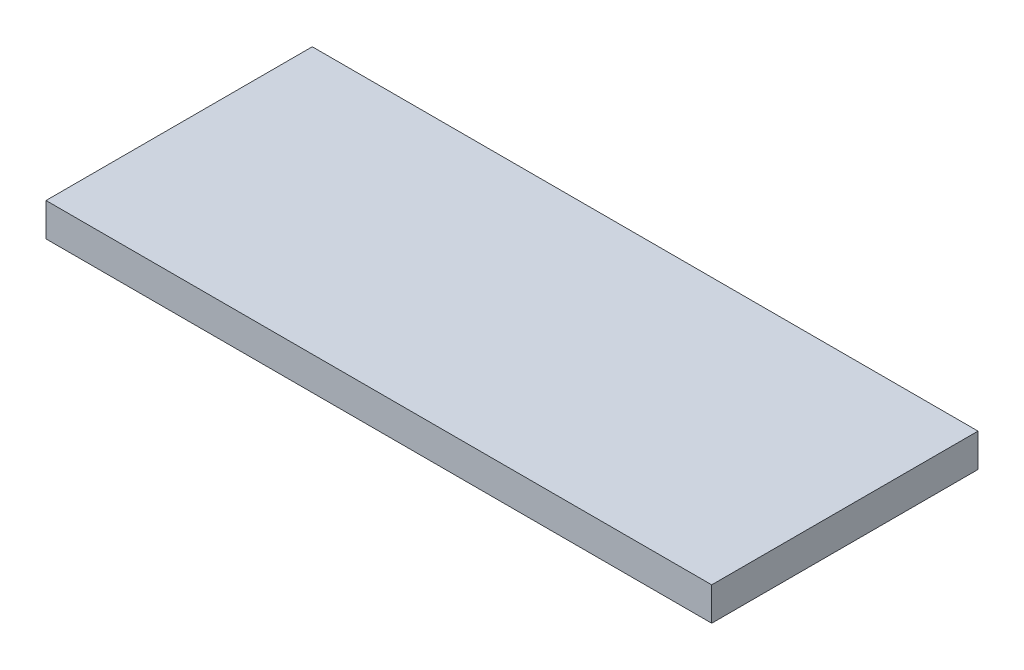
ISO-10303-21;
HEADER;
FILE_DESCRIPTION(('STEP AP214'),'2;1');
FILE_NAME('part.step','',(''),(''),'','','');
FILE_SCHEMA(('AUTOMOTIVE_DESIGN { 1 0 10303 214 1 1 1 1 }'));
ENDSEC;
DATA;
#1=APPLICATION_CONTEXT('core data for automotive mechanical design processes');
#2=APPLICATION_PROTOCOL_DEFINITION('international standard','automotive_design',2000,#1);
#3=PRODUCT_CONTEXT('',#1,'mechanical');
#4=PRODUCT('Part','Part','',(#3));
#5=PRODUCT_RELATED_PRODUCT_CATEGORY('part','',(#4));
#6=PRODUCT_DEFINITION_FORMATION('','',#4);
#7=PRODUCT_DEFINITION_CONTEXT('part definition',#1,'design');
#8=PRODUCT_DEFINITION('design','',#6,#7);
#9=PRODUCT_DEFINITION_SHAPE('','',#8);
#10=(LENGTH_UNIT() NAMED_UNIT(*) SI_UNIT(.MILLI.,.METRE.));
#11=(NAMED_UNIT(*) PLANE_ANGLE_UNIT() SI_UNIT($,.RADIAN.));
#12=(NAMED_UNIT(*) SI_UNIT($,.STERADIAN.) SOLID_ANGLE_UNIT());
#13=UNCERTAINTY_MEASURE_WITH_UNIT(LENGTH_MEASURE(1.E-05),#10,'distance_accuracy_value','');
#14=(GEOMETRIC_REPRESENTATION_CONTEXT(3) GLOBAL_UNCERTAINTY_ASSIGNED_CONTEXT((#13)) GLOBAL_UNIT_ASSIGNED_CONTEXT((#10,
#11,#12)) REPRESENTATION_CONTEXT('',''));
#15=CARTESIAN_POINT('',(0.,0.,0.));
#16=DIRECTION('',(0.,0.,1.));
#17=DIRECTION('',(1.,0.,0.));
#18=AXIS2_PLACEMENT_3D('',#15,#16,#17);
#19=CARTESIAN_POINT('',(0.,3.175,0.));
#20=DIRECTION('',(1.,0.,0.));
#21=DIRECTION('',(0.,0.,-1.));
#22=AXIS2_PLACEMENT_3D('',#19,#20,#21);
#23=PLANE('',#22);
#24=DIRECTION('',(0.,0.,1.));
#25=VECTOR('',#24,1.);
#26=CARTESIAN_POINT('',(0.,0.,0.));
#27=LINE('',#26,#25);
#28=CARTESIAN_POINT('',(0.,0.,0.));
#29=VERTEX_POINT('',#28);
#30=CARTESIAN_POINT('',(0.,0.,25.4));
#31=VERTEX_POINT('',#30);
#32=EDGE_CURVE('E96',#29,#31,#27,.T.);
#33=ORIENTED_EDGE('',*,*,#32,.T.);
#34=DIRECTION('',(0.,-1.,0.));
#35=VECTOR('',#34,1.);
#36=CARTESIAN_POINT('',(0.,3.175,25.4));
#37=LINE('',#36,#35);
#38=CARTESIAN_POINT('',(0.,3.175,25.4));
#39=VERTEX_POINT('',#38);
#40=EDGE_CURVE('E11',#39,#31,#37,.T.);
#41=ORIENTED_EDGE('',*,*,#40,.F.);
#42=DIRECTION('',(0.,0.,1.));
#43=VECTOR('',#42,1.);
#44=CARTESIAN_POINT('',(0.,3.175,0.));
#45=LINE('',#44,#43);
#46=CARTESIAN_POINT('',(0.,3.175,0.));
#47=VERTEX_POINT('',#46);
#48=EDGE_CURVE('E84',#47,#39,#45,.T.);
#49=ORIENTED_EDGE('',*,*,#48,.F.);
#50=DIRECTION('',(0.,-1.,0.));
#51=VECTOR('',#50,1.);
#52=CARTESIAN_POINT('',(0.,3.175,0.));
#53=LINE('',#52,#51);
#54=EDGE_CURVE('E92',#47,#29,#53,.T.);
#55=ORIENTED_EDGE('',*,*,#54,.T.);
#56=EDGE_LOOP('',(#33,#41,#49,#55));
#57=FACE_BOUND('',#56,.T.);
#58=ADVANCED_FACE('F33',(#57),#23,.F.);
#59=CARTESIAN_POINT('',(0.,3.175,25.4));
#60=DIRECTION('',(0.,0.,-1.));
#61=DIRECTION('',(-1.,0.,0.));
#62=AXIS2_PLACEMENT_3D('',#59,#60,#61);
#63=PLANE('',#62);
#64=DIRECTION('',(1.,0.,0.));
#65=VECTOR('',#64,1.);
#66=CARTESIAN_POINT('',(0.,0.,25.4));
#67=LINE('',#66,#65);
#68=CARTESIAN_POINT('',(63.5,0.,25.4));
#69=VERTEX_POINT('',#68);
#70=EDGE_CURVE('E88',#31,#69,#67,.T.);
#71=ORIENTED_EDGE('',*,*,#70,.T.);
#72=DIRECTION('',(0.,-1.,0.));
#73=VECTOR('',#72,1.);
#74=CARTESIAN_POINT('',(63.5,3.175,25.4));
#75=LINE('',#74,#73);
#76=CARTESIAN_POINT('',(63.5,3.175,25.4));
#77=VERTEX_POINT('',#76);
#78=EDGE_CURVE('E41',#77,#69,#75,.T.);
#79=ORIENTED_EDGE('',*,*,#78,.F.);
#80=DIRECTION('',(1.,0.,0.));
#81=VECTOR('',#80,1.);
#82=CARTESIAN_POINT('',(0.,3.175,25.4));
#83=LINE('',#82,#81);
#84=EDGE_CURVE('E79',#39,#77,#83,.T.);
#85=ORIENTED_EDGE('',*,*,#84,.F.);
#86=ORIENTED_EDGE('',*,*,#40,.T.);
#87=EDGE_LOOP('',(#71,#79,#85,#86));
#88=FACE_BOUND('',#87,.T.);
#89=ADVANCED_FACE('F87',(#88),#63,.F.);
#90=CARTESIAN_POINT('',(63.5,3.175,0.));
#91=DIRECTION('',(-1.,0.,0.));
#92=DIRECTION('',(0.,0.,1.));
#93=AXIS2_PLACEMENT_3D('',#90,#91,#92);
#94=PLANE('',#93);
#95=DIRECTION('',(0.,0.,-1.));
#96=VECTOR('',#95,1.);
#97=CARTESIAN_POINT('',(63.5,0.,0.));
#98=LINE('',#97,#96);
#99=CARTESIAN_POINT('',(63.5,0.,0.));
#100=VERTEX_POINT('',#99);
#101=EDGE_CURVE('E66',#69,#100,#98,.T.);
#102=ORIENTED_EDGE('',*,*,#101,.T.);
#103=DIRECTION('',(0.,-1.,0.));
#104=VECTOR('',#103,1.);
#105=CARTESIAN_POINT('',(63.5,3.175,0.));
#106=LINE('',#105,#104);
#107=CARTESIAN_POINT('',(63.5,3.175,0.));
#108=VERTEX_POINT('',#107);
#109=EDGE_CURVE('E89',#108,#100,#106,.T.);
#110=ORIENTED_EDGE('',*,*,#109,.F.);
#111=DIRECTION('',(0.,0.,-1.));
#112=VECTOR('',#111,1.);
#113=CARTESIAN_POINT('',(63.5,3.175,0.));
#114=LINE('',#113,#112);
#115=EDGE_CURVE('E82',#77,#108,#114,.T.);
#116=ORIENTED_EDGE('',*,*,#115,.F.);
#117=ORIENTED_EDGE('',*,*,#78,.T.);
#118=EDGE_LOOP('',(#102,#110,#116,#117));
#119=FACE_BOUND('',#118,.T.);
#120=ADVANCED_FACE('F90',(#119),#94,.F.);
#121=CARTESIAN_POINT('',(0.,3.175,0.));
#122=DIRECTION('',(0.,0.,1.));
#123=DIRECTION('',(1.,0.,0.));
#124=AXIS2_PLACEMENT_3D('',#121,#122,#123);
#125=PLANE('',#124);
#126=DIRECTION('',(-1.,0.,0.));
#127=VECTOR('',#126,1.);
#128=CARTESIAN_POINT('',(0.,0.,0.));
#129=LINE('',#128,#127);
#130=EDGE_CURVE('E72',#100,#29,#129,.T.);
#131=ORIENTED_EDGE('',*,*,#130,.T.);
#132=ORIENTED_EDGE('',*,*,#54,.F.);
#133=DIRECTION('',(-1.,0.,0.));
#134=VECTOR('',#133,1.);
#135=CARTESIAN_POINT('',(0.,3.175,0.));
#136=LINE('',#135,#134);
#137=EDGE_CURVE('E49',#108,#47,#136,.T.);
#138=ORIENTED_EDGE('',*,*,#137,.F.);
#139=ORIENTED_EDGE('',*,*,#109,.T.);
#140=EDGE_LOOP('',(#131,#132,#138,#139));
#141=FACE_BOUND('',#140,.T.);
#142=ADVANCED_FACE('F103',(#141),#125,.F.);
#143=CARTESIAN_POINT('',(0.,3.175,0.));
#144=DIRECTION('',(0.,1.,0.));
#145=DIRECTION('',(0.,0.,1.));
#146=AXIS2_PLACEMENT_3D('',#143,#144,#145);
#147=PLANE('',#146);
#148=ORIENTED_EDGE('',*,*,#48,.T.);
#149=ORIENTED_EDGE('',*,*,#84,.T.);
#150=ORIENTED_EDGE('',*,*,#115,.T.);
#151=ORIENTED_EDGE('',*,*,#137,.T.);
#152=EDGE_LOOP('',(#148,#149,#150,#151));
#153=FACE_BOUND('',#152,.T.);
#154=ADVANCED_FACE('F80',(#153),#147,.T.);
#155=CARTESIAN_POINT('',(0.,0.,0.));
#156=DIRECTION('',(0.,1.,0.));
#157=DIRECTION('',(0.,0.,1.));
#158=AXIS2_PLACEMENT_3D('',#155,#156,#157);
#159=PLANE('',#158);
#160=ORIENTED_EDGE('',*,*,#32,.F.);
#161=ORIENTED_EDGE('',*,*,#130,.F.);
#162=ORIENTED_EDGE('',*,*,#101,.F.);
#163=ORIENTED_EDGE('',*,*,#70,.F.);
#164=EDGE_LOOP('',(#160,#161,#162,#163));
#165=FACE_BOUND('',#164,.T.);
#166=ADVANCED_FACE('F106',(#165),#159,.F.);
#167=CLOSED_SHELL('',(#58,#89,#120,#142,#154,#166));
#168=MANIFOLD_SOLID_BREP('B2',#167);
#169=ADVANCED_BREP_SHAPE_REPRESENTATION('',(#18,#168),#14);
#170=SHAPE_DEFINITION_REPRESENTATION(#9,#169);
ENDSEC;
END-ISO-10303-21;
